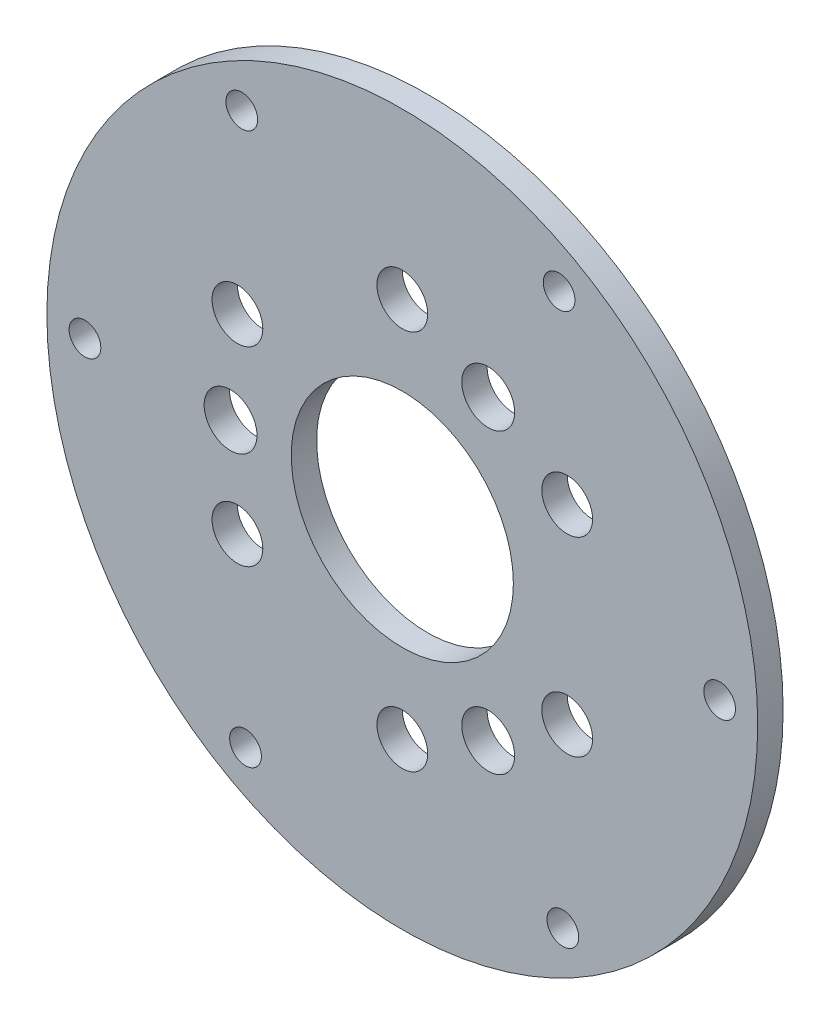
ISO-10303-21;
HEADER;
FILE_DESCRIPTION(('STEP AP214'),'2;1');
FILE_NAME('part.step','',(''),(''),'','','');
FILE_SCHEMA(('AUTOMOTIVE_DESIGN { 1 0 10303 214 1 1 1 1 }'));
ENDSEC;
DATA;
#1=APPLICATION_CONTEXT('core data for automotive mechanical design processes');
#2=APPLICATION_PROTOCOL_DEFINITION('international standard','automotive_design',2000,#1);
#3=PRODUCT_CONTEXT('',#1,'mechanical');
#4=PRODUCT('Part','Part','',(#3));
#5=PRODUCT_RELATED_PRODUCT_CATEGORY('part','',(#4));
#6=PRODUCT_DEFINITION_FORMATION('','',#4);
#7=PRODUCT_DEFINITION_CONTEXT('part definition',#1,'design');
#8=PRODUCT_DEFINITION('design','',#6,#7);
#9=PRODUCT_DEFINITION_SHAPE('','',#8);
#10=(LENGTH_UNIT() NAMED_UNIT(*) SI_UNIT(.MILLI.,.METRE.));
#11=(NAMED_UNIT(*) PLANE_ANGLE_UNIT() SI_UNIT($,.RADIAN.));
#12=(NAMED_UNIT(*) SI_UNIT($,.STERADIAN.) SOLID_ANGLE_UNIT());
#13=UNCERTAINTY_MEASURE_WITH_UNIT(LENGTH_MEASURE(1.E-05),#10,'distance_accuracy_value','');
#14=(GEOMETRIC_REPRESENTATION_CONTEXT(3) GLOBAL_UNCERTAINTY_ASSIGNED_CONTEXT((#13)) GLOBAL_UNIT_ASSIGNED_CONTEXT((#10,
#11,#12)) REPRESENTATION_CONTEXT('',''));
#15=CARTESIAN_POINT('',(0.,0.,0.));
#16=DIRECTION('',(0.,0.,1.));
#17=DIRECTION('',(1.,0.,0.));
#18=AXIS2_PLACEMENT_3D('',#15,#16,#17);
#19=CARTESIAN_POINT('',(0.,0.,2.));
#20=DIRECTION('',(0.,0.,1.));
#21=DIRECTION('',(1.,0.,0.));
#22=AXIS2_PLACEMENT_3D('',#19,#20,#21);
#23=PLANE('',#22);
#24=CARTESIAN_POINT('',(-24.9994171002763,-0.170718031686341,2.));
#25=DIRECTION('',(0.,0.,1.));
#26=DIRECTION('',(1.,0.,0.));
#27=AXIS2_PLACEMENT_3D('',#24,#25,#26);
#28=CIRCLE('',#27,1.25);
#29=CARTESIAN_POINT('',(-23.7494171002763,-0.170718031686341,2.));
#30=VERTEX_POINT('',#29);
#31=EDGE_CURVE('E126',#30,#30,#28,.T.);
#32=ORIENTED_EDGE('',*,*,#31,.F.);
#33=EDGE_LOOP('',(#32));
#34=FACE_BOUND('',#33,.T.);
#35=CARTESIAN_POINT('',(12.647554702464,-21.5647712728017,2.));
#36=DIRECTION('',(0.,0.,1.));
#37=DIRECTION('',(1.,0.,0.));
#38=AXIS2_PLACEMENT_3D('',#35,#36,#37);
#39=CIRCLE('',#38,1.25);
#40=CARTESIAN_POINT('',(13.897554702464,-21.5647712728017,2.));
#41=VERTEX_POINT('',#40);
#42=EDGE_CURVE('E114',#41,#41,#39,.T.);
#43=ORIENTED_EDGE('',*,*,#42,.F.);
#44=EDGE_LOOP('',(#43));
#45=FACE_BOUND('',#44,.T.);
#46=CARTESIAN_POINT('',(12.3518623978165,21.7354893044856,2.));
#47=DIRECTION('',(0.,0.,1.));
#48=DIRECTION('',(1.,0.,0.));
#49=AXIS2_PLACEMENT_3D('',#46,#47,#48);
#50=CIRCLE('',#49,1.25);
#51=CARTESIAN_POINT('',(13.6018623978165,21.7354893044856,2.));
#52=VERTEX_POINT('',#51);
#53=EDGE_CURVE('E102',#52,#52,#50,.T.);
#54=ORIENTED_EDGE('',*,*,#53,.F.);
#55=EDGE_LOOP('',(#54));
#56=FACE_BOUND('',#55,.T.);
#57=CARTESIAN_POINT('',(6.76500000000006,11.7173237132034,2.));
#58=DIRECTION('',(0.,0.,1.));
#59=DIRECTION('',(1.,0.,0.));
#60=AXIS2_PLACEMENT_3D('',#57,#58,#59);
#61=CIRCLE('',#60,2.08);
#62=CARTESIAN_POINT('',(8.84500000000006,11.7173237132034,2.));
#63=VERTEX_POINT('',#62);
#64=EDGE_CURVE('E90',#63,#63,#61,.T.);
#65=ORIENTED_EDGE('',*,*,#64,.F.);
#66=EDGE_LOOP('',(#65));
#67=FACE_BOUND('',#66,.T.);
#68=CARTESIAN_POINT('',(12.9903810567665,-7.50000000000015,2.));
#69=DIRECTION('',(0.,0.,1.));
#70=DIRECTION('',(1.,0.,0.));
#71=AXIS2_PLACEMENT_3D('',#68,#69,#70);
#72=CIRCLE('',#71,2.);
#73=CARTESIAN_POINT('',(14.9903810567665,-7.50000000000015,2.));
#74=VERTEX_POINT('',#73);
#75=EDGE_CURVE('E78',#74,#74,#72,.T.);
#76=ORIENTED_EDGE('',*,*,#75,.F.);
#77=EDGE_LOOP('',(#76));
#78=FACE_BOUND('',#77,.T.);
#79=CARTESIAN_POINT('',(1.047339298621E-13,15.,2.));
#80=DIRECTION('',(0.,0.,1.));
#81=DIRECTION('',(1.,0.,0.));
#82=AXIS2_PLACEMENT_3D('',#79,#80,#81);
#83=CIRCLE('',#82,2.);
#84=CARTESIAN_POINT('',(2.0000000000001,15.,2.));
#85=VERTEX_POINT('',#84);
#86=EDGE_CURVE('E66',#85,#85,#83,.T.);
#87=ORIENTED_EDGE('',*,*,#86,.F.);
#88=EDGE_LOOP('',(#87));
#89=FACE_BOUND('',#88,.T.);
#90=CARTESIAN_POINT('',(-12.9903810567666,-7.49999999999997,2.));
#91=DIRECTION('',(0.,0.,1.));
#92=DIRECTION('',(1.,0.,0.));
#93=AXIS2_PLACEMENT_3D('',#90,#91,#92);
#94=CIRCLE('',#93,2.);
#95=CARTESIAN_POINT('',(-10.9903810567666,-7.49999999999997,2.));
#96=VERTEX_POINT('',#95);
#97=EDGE_CURVE('E54',#96,#96,#94,.T.);
#98=ORIENTED_EDGE('',*,*,#97,.F.);
#99=EDGE_LOOP('',(#98));
#100=FACE_BOUND('',#99,.T.);
#101=CARTESIAN_POINT('',(0.,-15.,2.));
#102=DIRECTION('',(0.,0.,1.));
#103=DIRECTION('',(1.,0.,0.));
#104=AXIS2_PLACEMENT_3D('',#101,#102,#103);
#105=CIRCLE('',#104,2.);
#106=CARTESIAN_POINT('',(2.,-15.,2.));
#107=VERTEX_POINT('',#106);
#108=EDGE_CURVE('E43',#107,#107,#105,.T.);
#109=ORIENTED_EDGE('',*,*,#108,.F.);
#110=EDGE_LOOP('',(#109));
#111=FACE_BOUND('',#110,.T.);
#112=CARTESIAN_POINT('',(0.,0.,2.));
#113=DIRECTION('',(0.,0.,1.));
#114=DIRECTION('',(1.,0.,0.));
#115=AXIS2_PLACEMENT_3D('',#112,#113,#114);
#116=CIRCLE('',#115,28.);
#117=CARTESIAN_POINT('',(28.,0.,2.));
#118=VERTEX_POINT('',#117);
#119=EDGE_CURVE('E10',#118,#118,#116,.T.);
#120=ORIENTED_EDGE('',*,*,#119,.T.);
#121=EDGE_LOOP('',(#120));
#122=FACE_BOUND('',#121,.T.);
#123=CARTESIAN_POINT('',(-13.53,0.,2.));
#124=DIRECTION('',(0.,0.,1.));
#125=DIRECTION('',(1.,0.,0.));
#126=AXIS2_PLACEMENT_3D('',#123,#124,#125);
#127=CIRCLE('',#126,2.08);
#128=CARTESIAN_POINT('',(-11.45,0.,2.));
#129=VERTEX_POINT('',#128);
#130=EDGE_CURVE('E48',#129,#129,#127,.T.);
#131=ORIENTED_EDGE('',*,*,#130,.F.);
#132=EDGE_LOOP('',(#131));
#133=FACE_BOUND('',#132,.T.);
#134=CARTESIAN_POINT('',(-12.9903810567665,7.50000000000006,2.));
#135=DIRECTION('',(0.,0.,1.));
#136=DIRECTION('',(1.,0.,0.));
#137=AXIS2_PLACEMENT_3D('',#134,#135,#136);
#138=CIRCLE('',#137,2.);
#139=CARTESIAN_POINT('',(-10.9903810567665,7.50000000000006,2.));
#140=VERTEX_POINT('',#139);
#141=EDGE_CURVE('E60',#140,#140,#138,.T.);
#142=ORIENTED_EDGE('',*,*,#141,.F.);
#143=EDGE_LOOP('',(#142));
#144=FACE_BOUND('',#143,.T.);
#145=CARTESIAN_POINT('',(12.9903810567667,7.49999999999988,2.));
#146=DIRECTION('',(0.,0.,1.));
#147=DIRECTION('',(1.,0.,0.));
#148=AXIS2_PLACEMENT_3D('',#145,#146,#147);
#149=CIRCLE('',#148,2.);
#150=CARTESIAN_POINT('',(14.9903810567667,7.49999999999988,2.));
#151=VERTEX_POINT('',#150);
#152=EDGE_CURVE('E72',#151,#151,#149,.T.);
#153=ORIENTED_EDGE('',*,*,#152,.F.);
#154=EDGE_LOOP('',(#153));
#155=FACE_BOUND('',#154,.T.);
#156=CARTESIAN_POINT('',(0.,0.,2.));
#157=DIRECTION('',(0.,0.,1.));
#158=DIRECTION('',(1.,0.,0.));
#159=AXIS2_PLACEMENT_3D('',#156,#157,#158);
#160=CIRCLE('',#159,8.75);
#161=CARTESIAN_POINT('',(8.75,0.,2.));
#162=VERTEX_POINT('',#161);
#163=EDGE_CURVE('E84',#162,#162,#160,.T.);
#164=ORIENTED_EDGE('',*,*,#163,.F.);
#165=EDGE_LOOP('',(#164));
#166=FACE_BOUND('',#165,.T.);
#167=CARTESIAN_POINT('',(6.76499999999989,-11.7173237132035,2.));
#168=DIRECTION('',(0.,0.,1.));
#169=DIRECTION('',(1.,0.,0.));
#170=AXIS2_PLACEMENT_3D('',#167,#168,#169);
#171=CIRCLE('',#170,2.08);
#172=CARTESIAN_POINT('',(8.84499999999989,-11.7173237132035,2.));
#173=VERTEX_POINT('',#172);
#174=EDGE_CURVE('E96',#173,#173,#171,.T.);
#175=ORIENTED_EDGE('',*,*,#174,.F.);
#176=EDGE_LOOP('',(#175));
#177=FACE_BOUND('',#176,.T.);
#178=CARTESIAN_POINT('',(24.9994171002791,0.170718031684702,2.));
#179=DIRECTION('',(0.,0.,1.));
#180=DIRECTION('',(1.,0.,0.));
#181=AXIS2_PLACEMENT_3D('',#178,#179,#180);
#182=CIRCLE('',#181,1.25);
#183=CARTESIAN_POINT('',(26.2494171002791,0.170718031684702,2.));
#184=VERTEX_POINT('',#183);
#185=EDGE_CURVE('E108',#184,#184,#182,.T.);
#186=ORIENTED_EDGE('',*,*,#185,.F.);
#187=EDGE_LOOP('',(#186));
#188=FACE_BOUND('',#187,.T.);
#189=CARTESIAN_POINT('',(-12.3518623978137,-21.7354893044872,2.));
#190=DIRECTION('',(0.,0.,1.));
#191=DIRECTION('',(1.,0.,0.));
#192=AXIS2_PLACEMENT_3D('',#189,#190,#191);
#193=CIRCLE('',#192,1.25);
#194=CARTESIAN_POINT('',(-11.1018623978137,-21.7354893044872,2.));
#195=VERTEX_POINT('',#194);
#196=EDGE_CURVE('E120',#195,#195,#193,.T.);
#197=ORIENTED_EDGE('',*,*,#196,.F.);
#198=EDGE_LOOP('',(#197));
#199=FACE_BOUND('',#198,.T.);
#200=CARTESIAN_POINT('',(-12.6475547024612,21.5647712728,2.));
#201=DIRECTION('',(0.,0.,1.));
#202=DIRECTION('',(1.,0.,0.));
#203=AXIS2_PLACEMENT_3D('',#200,#201,#202);
#204=CIRCLE('',#203,1.25);
#205=CARTESIAN_POINT('',(-11.3975547024612,21.5647712728,2.));
#206=VERTEX_POINT('',#205);
#207=EDGE_CURVE('E132',#206,#206,#204,.T.);
#208=ORIENTED_EDGE('',*,*,#207,.F.);
#209=EDGE_LOOP('',(#208));
#210=FACE_BOUND('',#209,.T.);
#211=ADVANCED_FACE('F32',(#34,#45,#56,#67,#78,#89,#100,#111,#122,#133,#144,#155,#166,#177,#188,
#199,#210),#23,.T.);
#212=CARTESIAN_POINT('',(0.,0.,0.));
#213=DIRECTION('',(0.,0.,1.));
#214=DIRECTION('',(1.,0.,0.));
#215=AXIS2_PLACEMENT_3D('',#212,#213,#214);
#216=PLANE('',#215);
#217=CARTESIAN_POINT('',(0.,0.,0.));
#218=DIRECTION('',(0.,0.,1.));
#219=DIRECTION('',(1.,0.,0.));
#220=AXIS2_PLACEMENT_3D('',#217,#218,#219);
#221=CIRCLE('',#220,28.);
#222=CARTESIAN_POINT('',(28.,0.,0.));
#223=VERTEX_POINT('',#222);
#224=EDGE_CURVE('E36',#223,#223,#221,.T.);
#225=ORIENTED_EDGE('',*,*,#224,.F.);
#226=EDGE_LOOP('',(#225));
#227=FACE_BOUND('',#226,.T.);
#228=CARTESIAN_POINT('',(0.,-15.,0.));
#229=DIRECTION('',(0.,0.,1.));
#230=DIRECTION('',(1.,0.,0.));
#231=AXIS2_PLACEMENT_3D('',#228,#229,#230);
#232=CIRCLE('',#231,2.);
#233=CARTESIAN_POINT('',(2.,-15.,0.));
#234=VERTEX_POINT('',#233);
#235=EDGE_CURVE('E45',#234,#234,#232,.T.);
#236=ORIENTED_EDGE('',*,*,#235,.T.);
#237=EDGE_LOOP('',(#236));
#238=FACE_BOUND('',#237,.T.);
#239=CARTESIAN_POINT('',(-13.53,0.,0.));
#240=DIRECTION('',(0.,0.,1.));
#241=DIRECTION('',(1.,0.,0.));
#242=AXIS2_PLACEMENT_3D('',#239,#240,#241);
#243=CIRCLE('',#242,2.08);
#244=CARTESIAN_POINT('',(-11.45,0.,0.));
#245=VERTEX_POINT('',#244);
#246=EDGE_CURVE('E51',#245,#245,#243,.T.);
#247=ORIENTED_EDGE('',*,*,#246,.T.);
#248=EDGE_LOOP('',(#247));
#249=FACE_BOUND('',#248,.T.);
#250=CARTESIAN_POINT('',(-12.9903810567666,-7.49999999999997,0.));
#251=DIRECTION('',(0.,0.,1.));
#252=DIRECTION('',(1.,0.,0.));
#253=AXIS2_PLACEMENT_3D('',#250,#251,#252);
#254=CIRCLE('',#253,2.);
#255=CARTESIAN_POINT('',(-10.9903810567666,-7.49999999999997,0.));
#256=VERTEX_POINT('',#255);
#257=EDGE_CURVE('E57',#256,#256,#254,.T.);
#258=ORIENTED_EDGE('',*,*,#257,.T.);
#259=EDGE_LOOP('',(#258));
#260=FACE_BOUND('',#259,.T.);
#261=CARTESIAN_POINT('',(-12.9903810567665,7.50000000000006,0.));
#262=DIRECTION('',(0.,0.,1.));
#263=DIRECTION('',(1.,0.,0.));
#264=AXIS2_PLACEMENT_3D('',#261,#262,#263);
#265=CIRCLE('',#264,2.);
#266=CARTESIAN_POINT('',(-10.9903810567665,7.50000000000006,0.));
#267=VERTEX_POINT('',#266);
#268=EDGE_CURVE('E63',#267,#267,#265,.T.);
#269=ORIENTED_EDGE('',*,*,#268,.T.);
#270=EDGE_LOOP('',(#269));
#271=FACE_BOUND('',#270,.T.);
#272=CARTESIAN_POINT('',(1.047339298621E-13,15.,0.));
#273=DIRECTION('',(0.,0.,1.));
#274=DIRECTION('',(1.,0.,0.));
#275=AXIS2_PLACEMENT_3D('',#272,#273,#274);
#276=CIRCLE('',#275,2.);
#277=CARTESIAN_POINT('',(2.0000000000001,15.,0.));
#278=VERTEX_POINT('',#277);
#279=EDGE_CURVE('E69',#278,#278,#276,.T.);
#280=ORIENTED_EDGE('',*,*,#279,.T.);
#281=EDGE_LOOP('',(#280));
#282=FACE_BOUND('',#281,.T.);
#283=CARTESIAN_POINT('',(12.9903810567667,7.49999999999988,0.));
#284=DIRECTION('',(0.,0.,1.));
#285=DIRECTION('',(1.,0.,0.));
#286=AXIS2_PLACEMENT_3D('',#283,#284,#285);
#287=CIRCLE('',#286,2.);
#288=CARTESIAN_POINT('',(14.9903810567667,7.49999999999988,0.));
#289=VERTEX_POINT('',#288);
#290=EDGE_CURVE('E75',#289,#289,#287,.T.);
#291=ORIENTED_EDGE('',*,*,#290,.T.);
#292=EDGE_LOOP('',(#291));
#293=FACE_BOUND('',#292,.T.);
#294=CARTESIAN_POINT('',(12.9903810567665,-7.50000000000015,0.));
#295=DIRECTION('',(0.,0.,1.));
#296=DIRECTION('',(1.,0.,0.));
#297=AXIS2_PLACEMENT_3D('',#294,#295,#296);
#298=CIRCLE('',#297,2.);
#299=CARTESIAN_POINT('',(14.9903810567665,-7.50000000000015,0.));
#300=VERTEX_POINT('',#299);
#301=EDGE_CURVE('E81',#300,#300,#298,.T.);
#302=ORIENTED_EDGE('',*,*,#301,.T.);
#303=EDGE_LOOP('',(#302));
#304=FACE_BOUND('',#303,.T.);
#305=CARTESIAN_POINT('',(0.,0.,0.));
#306=DIRECTION('',(0.,0.,1.));
#307=DIRECTION('',(1.,0.,0.));
#308=AXIS2_PLACEMENT_3D('',#305,#306,#307);
#309=CIRCLE('',#308,8.75);
#310=CARTESIAN_POINT('',(8.75,0.,0.));
#311=VERTEX_POINT('',#310);
#312=EDGE_CURVE('E87',#311,#311,#309,.T.);
#313=ORIENTED_EDGE('',*,*,#312,.T.);
#314=EDGE_LOOP('',(#313));
#315=FACE_BOUND('',#314,.T.);
#316=CARTESIAN_POINT('',(6.76500000000006,11.7173237132034,0.));
#317=DIRECTION('',(0.,0.,1.));
#318=DIRECTION('',(1.,0.,0.));
#319=AXIS2_PLACEMENT_3D('',#316,#317,#318);
#320=CIRCLE('',#319,2.08);
#321=CARTESIAN_POINT('',(8.84500000000006,11.7173237132034,0.));
#322=VERTEX_POINT('',#321);
#323=EDGE_CURVE('E93',#322,#322,#320,.T.);
#324=ORIENTED_EDGE('',*,*,#323,.T.);
#325=EDGE_LOOP('',(#324));
#326=FACE_BOUND('',#325,.T.);
#327=CARTESIAN_POINT('',(6.76499999999989,-11.7173237132035,0.));
#328=DIRECTION('',(0.,0.,1.));
#329=DIRECTION('',(1.,0.,0.));
#330=AXIS2_PLACEMENT_3D('',#327,#328,#329);
#331=CIRCLE('',#330,2.08);
#332=CARTESIAN_POINT('',(8.84499999999989,-11.7173237132035,0.));
#333=VERTEX_POINT('',#332);
#334=EDGE_CURVE('E99',#333,#333,#331,.T.);
#335=ORIENTED_EDGE('',*,*,#334,.T.);
#336=EDGE_LOOP('',(#335));
#337=FACE_BOUND('',#336,.T.);
#338=CARTESIAN_POINT('',(12.3518623978165,21.7354893044856,0.));
#339=DIRECTION('',(0.,0.,1.));
#340=DIRECTION('',(1.,0.,0.));
#341=AXIS2_PLACEMENT_3D('',#338,#339,#340);
#342=CIRCLE('',#341,1.25);
#343=CARTESIAN_POINT('',(13.6018623978165,21.7354893044856,0.));
#344=VERTEX_POINT('',#343);
#345=EDGE_CURVE('E105',#344,#344,#342,.T.);
#346=ORIENTED_EDGE('',*,*,#345,.T.);
#347=EDGE_LOOP('',(#346));
#348=FACE_BOUND('',#347,.T.);
#349=CARTESIAN_POINT('',(24.9994171002791,0.170718031684702,0.));
#350=DIRECTION('',(0.,0.,1.));
#351=DIRECTION('',(1.,0.,0.));
#352=AXIS2_PLACEMENT_3D('',#349,#350,#351);
#353=CIRCLE('',#352,1.25);
#354=CARTESIAN_POINT('',(26.2494171002791,0.170718031684702,0.));
#355=VERTEX_POINT('',#354);
#356=EDGE_CURVE('E111',#355,#355,#353,.T.);
#357=ORIENTED_EDGE('',*,*,#356,.T.);
#358=EDGE_LOOP('',(#357));
#359=FACE_BOUND('',#358,.T.);
#360=CARTESIAN_POINT('',(12.647554702464,-21.5647712728017,0.));
#361=DIRECTION('',(0.,0.,1.));
#362=DIRECTION('',(1.,0.,0.));
#363=AXIS2_PLACEMENT_3D('',#360,#361,#362);
#364=CIRCLE('',#363,1.25);
#365=CARTESIAN_POINT('',(13.897554702464,-21.5647712728017,0.));
#366=VERTEX_POINT('',#365);
#367=EDGE_CURVE('E117',#366,#366,#364,.T.);
#368=ORIENTED_EDGE('',*,*,#367,.T.);
#369=EDGE_LOOP('',(#368));
#370=FACE_BOUND('',#369,.T.);
#371=CARTESIAN_POINT('',(-12.3518623978137,-21.7354893044872,0.));
#372=DIRECTION('',(0.,0.,1.));
#373=DIRECTION('',(1.,0.,0.));
#374=AXIS2_PLACEMENT_3D('',#371,#372,#373);
#375=CIRCLE('',#374,1.25);
#376=CARTESIAN_POINT('',(-11.1018623978137,-21.7354893044872,0.));
#377=VERTEX_POINT('',#376);
#378=EDGE_CURVE('E123',#377,#377,#375,.T.);
#379=ORIENTED_EDGE('',*,*,#378,.T.);
#380=EDGE_LOOP('',(#379));
#381=FACE_BOUND('',#380,.T.);
#382=CARTESIAN_POINT('',(-24.9994171002763,-0.170718031686341,0.));
#383=DIRECTION('',(0.,0.,1.));
#384=DIRECTION('',(1.,0.,0.));
#385=AXIS2_PLACEMENT_3D('',#382,#383,#384);
#386=CIRCLE('',#385,1.25);
#387=CARTESIAN_POINT('',(-23.7494171002763,-0.170718031686341,0.));
#388=VERTEX_POINT('',#387);
#389=EDGE_CURVE('E129',#388,#388,#386,.T.);
#390=ORIENTED_EDGE('',*,*,#389,.T.);
#391=EDGE_LOOP('',(#390));
#392=FACE_BOUND('',#391,.T.);
#393=CARTESIAN_POINT('',(-12.6475547024612,21.5647712728,0.));
#394=DIRECTION('',(0.,0.,1.));
#395=DIRECTION('',(1.,0.,0.));
#396=AXIS2_PLACEMENT_3D('',#393,#394,#395);
#397=CIRCLE('',#396,1.25);
#398=CARTESIAN_POINT('',(-11.3975547024612,21.5647712728,0.));
#399=VERTEX_POINT('',#398);
#400=EDGE_CURVE('E135',#399,#399,#397,.T.);
#401=ORIENTED_EDGE('',*,*,#400,.T.);
#402=EDGE_LOOP('',(#401));
#403=FACE_BOUND('',#402,.T.);
#404=ADVANCED_FACE('F145',(#227,#238,#249,#260,#271,#282,#293,#304,#315,#326,#337,#348,#359,
#370,#381,#392,#403),#216,.F.);
#405=CARTESIAN_POINT('',(0.,0.,2.));
#406=DIRECTION('',(0.,0.,-1.));
#407=DIRECTION('',(-1.,0.,0.));
#408=AXIS2_PLACEMENT_3D('',#405,#406,#407);
#409=CYLINDRICAL_SURFACE('',#408,28.);
#410=ORIENTED_EDGE('',*,*,#119,.F.);
#411=EDGE_LOOP('',(#410));
#412=FACE_BOUND('',#411,.T.);
#413=ORIENTED_EDGE('',*,*,#224,.T.);
#414=EDGE_LOOP('',(#413));
#415=FACE_BOUND('',#414,.T.);
#416=ADVANCED_FACE('F34',(#412,#415),#409,.T.);
#417=CARTESIAN_POINT('',(0.,-15.,2.));
#418=DIRECTION('',(0.,0.,-1.));
#419=DIRECTION('',(-1.,0.,0.));
#420=AXIS2_PLACEMENT_3D('',#417,#418,#419);
#421=CYLINDRICAL_SURFACE('',#420,2.);
#422=ORIENTED_EDGE('',*,*,#108,.T.);
#423=EDGE_LOOP('',(#422));
#424=FACE_BOUND('',#423,.T.);
#425=ORIENTED_EDGE('',*,*,#235,.F.);
#426=EDGE_LOOP('',(#425));
#427=FACE_BOUND('',#426,.T.);
#428=ADVANCED_FACE('F155',(#424,#427),#421,.F.);
#429=CARTESIAN_POINT('',(-13.53,0.,2.));
#430=DIRECTION('',(0.,0.,-1.));
#431=DIRECTION('',(-1.,0.,0.));
#432=AXIS2_PLACEMENT_3D('',#429,#430,#431);
#433=CYLINDRICAL_SURFACE('',#432,2.08);
#434=ORIENTED_EDGE('',*,*,#130,.T.);
#435=EDGE_LOOP('',(#434));
#436=FACE_BOUND('',#435,.T.);
#437=ORIENTED_EDGE('',*,*,#246,.F.);
#438=EDGE_LOOP('',(#437));
#439=FACE_BOUND('',#438,.T.);
#440=ADVANCED_FACE('F158',(#436,#439),#433,.F.);
#441=CARTESIAN_POINT('',(-12.9903810567666,-7.49999999999997,2.));
#442=DIRECTION('',(0.,0.,-1.));
#443=DIRECTION('',(-1.,0.,0.));
#444=AXIS2_PLACEMENT_3D('',#441,#442,#443);
#445=CYLINDRICAL_SURFACE('',#444,2.);
#446=ORIENTED_EDGE('',*,*,#97,.T.);
#447=EDGE_LOOP('',(#446));
#448=FACE_BOUND('',#447,.T.);
#449=ORIENTED_EDGE('',*,*,#257,.F.);
#450=EDGE_LOOP('',(#449));
#451=FACE_BOUND('',#450,.T.);
#452=ADVANCED_FACE('F162',(#448,#451),#445,.F.);
#453=CARTESIAN_POINT('',(-12.9903810567665,7.50000000000006,2.));
#454=DIRECTION('',(0.,0.,-1.));
#455=DIRECTION('',(-1.,0.,0.));
#456=AXIS2_PLACEMENT_3D('',#453,#454,#455);
#457=CYLINDRICAL_SURFACE('',#456,2.);
#458=ORIENTED_EDGE('',*,*,#141,.T.);
#459=EDGE_LOOP('',(#458));
#460=FACE_BOUND('',#459,.T.);
#461=ORIENTED_EDGE('',*,*,#268,.F.);
#462=EDGE_LOOP('',(#461));
#463=FACE_BOUND('',#462,.T.);
#464=ADVANCED_FACE('F166',(#460,#463),#457,.F.);
#465=CARTESIAN_POINT('',(1.047339298621E-13,15.,2.));
#466=DIRECTION('',(0.,0.,-1.));
#467=DIRECTION('',(-1.,0.,0.));
#468=AXIS2_PLACEMENT_3D('',#465,#466,#467);
#469=CYLINDRICAL_SURFACE('',#468,2.);
#470=ORIENTED_EDGE('',*,*,#86,.T.);
#471=EDGE_LOOP('',(#470));
#472=FACE_BOUND('',#471,.T.);
#473=ORIENTED_EDGE('',*,*,#279,.F.);
#474=EDGE_LOOP('',(#473));
#475=FACE_BOUND('',#474,.T.);
#476=ADVANCED_FACE('F170',(#472,#475),#469,.F.);
#477=CARTESIAN_POINT('',(12.9903810567667,7.49999999999988,2.));
#478=DIRECTION('',(0.,0.,-1.));
#479=DIRECTION('',(-1.,0.,0.));
#480=AXIS2_PLACEMENT_3D('',#477,#478,#479);
#481=CYLINDRICAL_SURFACE('',#480,2.);
#482=ORIENTED_EDGE('',*,*,#152,.T.);
#483=EDGE_LOOP('',(#482));
#484=FACE_BOUND('',#483,.T.);
#485=ORIENTED_EDGE('',*,*,#290,.F.);
#486=EDGE_LOOP('',(#485));
#487=FACE_BOUND('',#486,.T.);
#488=ADVANCED_FACE('F174',(#484,#487),#481,.F.);
#489=CARTESIAN_POINT('',(12.9903810567665,-7.50000000000015,2.));
#490=DIRECTION('',(0.,0.,-1.));
#491=DIRECTION('',(-1.,0.,0.));
#492=AXIS2_PLACEMENT_3D('',#489,#490,#491);
#493=CYLINDRICAL_SURFACE('',#492,2.);
#494=ORIENTED_EDGE('',*,*,#75,.T.);
#495=EDGE_LOOP('',(#494));
#496=FACE_BOUND('',#495,.T.);
#497=ORIENTED_EDGE('',*,*,#301,.F.);
#498=EDGE_LOOP('',(#497));
#499=FACE_BOUND('',#498,.T.);
#500=ADVANCED_FACE('F178',(#496,#499),#493,.F.);
#501=CARTESIAN_POINT('',(0.,0.,2.));
#502=DIRECTION('',(0.,0.,-1.));
#503=DIRECTION('',(-1.,0.,0.));
#504=AXIS2_PLACEMENT_3D('',#501,#502,#503);
#505=CYLINDRICAL_SURFACE('',#504,8.75);
#506=ORIENTED_EDGE('',*,*,#163,.T.);
#507=EDGE_LOOP('',(#506));
#508=FACE_BOUND('',#507,.T.);
#509=ORIENTED_EDGE('',*,*,#312,.F.);
#510=EDGE_LOOP('',(#509));
#511=FACE_BOUND('',#510,.T.);
#512=ADVANCED_FACE('F182',(#508,#511),#505,.F.);
#513=CARTESIAN_POINT('',(6.76500000000006,11.7173237132034,2.));
#514=DIRECTION('',(0.,0.,-1.));
#515=DIRECTION('',(-1.,0.,0.));
#516=AXIS2_PLACEMENT_3D('',#513,#514,#515);
#517=CYLINDRICAL_SURFACE('',#516,2.08);
#518=ORIENTED_EDGE('',*,*,#64,.T.);
#519=EDGE_LOOP('',(#518));
#520=FACE_BOUND('',#519,.T.);
#521=ORIENTED_EDGE('',*,*,#323,.F.);
#522=EDGE_LOOP('',(#521));
#523=FACE_BOUND('',#522,.T.);
#524=ADVANCED_FACE('F186',(#520,#523),#517,.F.);
#525=CARTESIAN_POINT('',(6.76499999999989,-11.7173237132035,2.));
#526=DIRECTION('',(0.,0.,-1.));
#527=DIRECTION('',(-1.,0.,0.));
#528=AXIS2_PLACEMENT_3D('',#525,#526,#527);
#529=CYLINDRICAL_SURFACE('',#528,2.08);
#530=ORIENTED_EDGE('',*,*,#174,.T.);
#531=EDGE_LOOP('',(#530));
#532=FACE_BOUND('',#531,.T.);
#533=ORIENTED_EDGE('',*,*,#334,.F.);
#534=EDGE_LOOP('',(#533));
#535=FACE_BOUND('',#534,.T.);
#536=ADVANCED_FACE('F190',(#532,#535),#529,.F.);
#537=CARTESIAN_POINT('',(12.3518623978165,21.7354893044856,2.));
#538=DIRECTION('',(0.,0.,-1.));
#539=DIRECTION('',(-1.,0.,0.));
#540=AXIS2_PLACEMENT_3D('',#537,#538,#539);
#541=CYLINDRICAL_SURFACE('',#540,1.25);
#542=ORIENTED_EDGE('',*,*,#53,.T.);
#543=EDGE_LOOP('',(#542));
#544=FACE_BOUND('',#543,.T.);
#545=ORIENTED_EDGE('',*,*,#345,.F.);
#546=EDGE_LOOP('',(#545));
#547=FACE_BOUND('',#546,.T.);
#548=ADVANCED_FACE('F194',(#544,#547),#541,.F.);
#549=CARTESIAN_POINT('',(24.9994171002791,0.170718031684702,2.));
#550=DIRECTION('',(0.,0.,-1.));
#551=DIRECTION('',(-1.,0.,0.));
#552=AXIS2_PLACEMENT_3D('',#549,#550,#551);
#553=CYLINDRICAL_SURFACE('',#552,1.25);
#554=ORIENTED_EDGE('',*,*,#185,.T.);
#555=EDGE_LOOP('',(#554));
#556=FACE_BOUND('',#555,.T.);
#557=ORIENTED_EDGE('',*,*,#356,.F.);
#558=EDGE_LOOP('',(#557));
#559=FACE_BOUND('',#558,.T.);
#560=ADVANCED_FACE('F198',(#556,#559),#553,.F.);
#561=CARTESIAN_POINT('',(12.647554702464,-21.5647712728017,2.));
#562=DIRECTION('',(0.,0.,-1.));
#563=DIRECTION('',(-1.,0.,0.));
#564=AXIS2_PLACEMENT_3D('',#561,#562,#563);
#565=CYLINDRICAL_SURFACE('',#564,1.25);
#566=ORIENTED_EDGE('',*,*,#42,.T.);
#567=EDGE_LOOP('',(#566));
#568=FACE_BOUND('',#567,.T.);
#569=ORIENTED_EDGE('',*,*,#367,.F.);
#570=EDGE_LOOP('',(#569));
#571=FACE_BOUND('',#570,.T.);
#572=ADVANCED_FACE('F202',(#568,#571),#565,.F.);
#573=CARTESIAN_POINT('',(-12.3518623978137,-21.7354893044872,2.));
#574=DIRECTION('',(0.,0.,-1.));
#575=DIRECTION('',(-1.,0.,0.));
#576=AXIS2_PLACEMENT_3D('',#573,#574,#575);
#577=CYLINDRICAL_SURFACE('',#576,1.25);
#578=ORIENTED_EDGE('',*,*,#196,.T.);
#579=EDGE_LOOP('',(#578));
#580=FACE_BOUND('',#579,.T.);
#581=ORIENTED_EDGE('',*,*,#378,.F.);
#582=EDGE_LOOP('',(#581));
#583=FACE_BOUND('',#582,.T.);
#584=ADVANCED_FACE('F206',(#580,#583),#577,.F.);
#585=CARTESIAN_POINT('',(-24.9994171002763,-0.170718031686341,2.));
#586=DIRECTION('',(0.,0.,-1.));
#587=DIRECTION('',(-1.,0.,0.));
#588=AXIS2_PLACEMENT_3D('',#585,#586,#587);
#589=CYLINDRICAL_SURFACE('',#588,1.25);
#590=ORIENTED_EDGE('',*,*,#31,.T.);
#591=EDGE_LOOP('',(#590));
#592=FACE_BOUND('',#591,.T.);
#593=ORIENTED_EDGE('',*,*,#389,.F.);
#594=EDGE_LOOP('',(#593));
#595=FACE_BOUND('',#594,.T.);
#596=ADVANCED_FACE('F210',(#592,#595),#589,.F.);
#597=CARTESIAN_POINT('',(-12.6475547024612,21.5647712728,2.));
#598=DIRECTION('',(0.,0.,-1.));
#599=DIRECTION('',(-1.,0.,0.));
#600=AXIS2_PLACEMENT_3D('',#597,#598,#599);
#601=CYLINDRICAL_SURFACE('',#600,1.25);
#602=ORIENTED_EDGE('',*,*,#207,.T.);
#603=EDGE_LOOP('',(#602));
#604=FACE_BOUND('',#603,.T.);
#605=ORIENTED_EDGE('',*,*,#400,.F.);
#606=EDGE_LOOP('',(#605));
#607=FACE_BOUND('',#606,.T.);
#608=ADVANCED_FACE('F141',(#604,#607),#601,.F.);
#609=CLOSED_SHELL('',(#211,#404,#416,#428,#440,#452,#464,#476,#488,#500,#512,#524,#536,#548,
#560,#572,#584,#596,#608));
#610=MANIFOLD_SOLID_BREP('B2',#609);
#611=ADVANCED_BREP_SHAPE_REPRESENTATION('',(#18,#610),#14);
#612=SHAPE_DEFINITION_REPRESENTATION(#9,#611);
ENDSEC;
END-ISO-10303-21;
